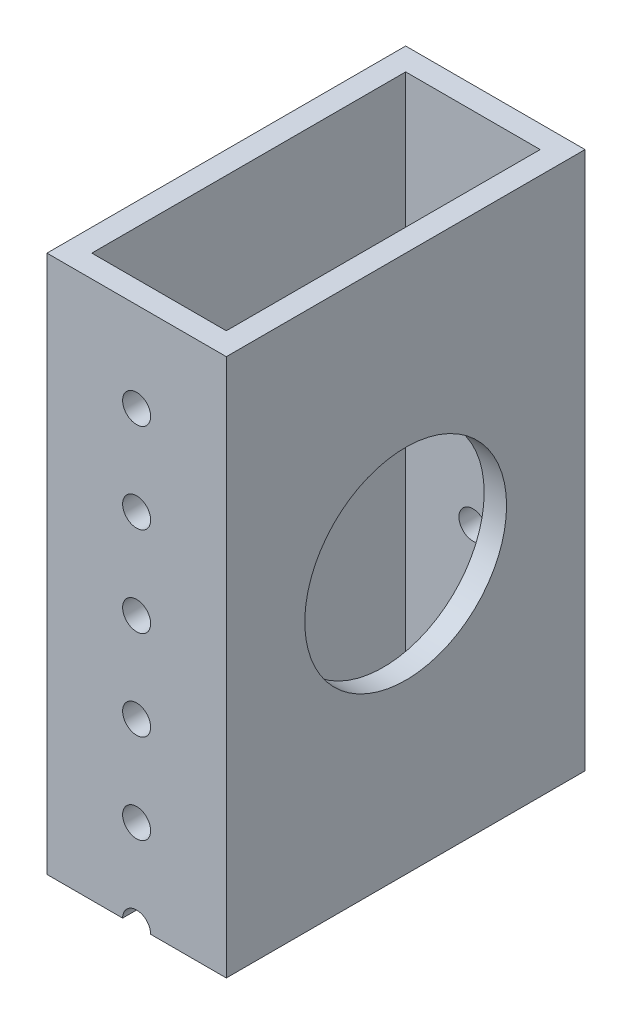
ISO-10303-21;
HEADER;
FILE_DESCRIPTION(('STEP AP214'),'2;1');
FILE_NAME('part.step','',(''),(''),'','','');
FILE_SCHEMA(('AUTOMOTIVE_DESIGN { 1 0 10303 214 1 1 1 1 }'));
ENDSEC;
DATA;
#1=APPLICATION_CONTEXT('core data for automotive mechanical design processes');
#2=APPLICATION_PROTOCOL_DEFINITION('international standard','automotive_design',2000,#1);
#3=PRODUCT_CONTEXT('',#1,'mechanical');
#4=PRODUCT('Part','Part','',(#3));
#5=PRODUCT_RELATED_PRODUCT_CATEGORY('part','',(#4));
#6=PRODUCT_DEFINITION_FORMATION('','',#4);
#7=PRODUCT_DEFINITION_CONTEXT('part definition',#1,'design');
#8=PRODUCT_DEFINITION('design','',#6,#7);
#9=PRODUCT_DEFINITION_SHAPE('','',#8);
#10=(LENGTH_UNIT() NAMED_UNIT(*) SI_UNIT(.MILLI.,.METRE.));
#11=(NAMED_UNIT(*) PLANE_ANGLE_UNIT() SI_UNIT($,.RADIAN.));
#12=(NAMED_UNIT(*) SI_UNIT($,.STERADIAN.) SOLID_ANGLE_UNIT());
#13=UNCERTAINTY_MEASURE_WITH_UNIT(LENGTH_MEASURE(1.E-05),#10,'distance_accuracy_value','');
#14=(GEOMETRIC_REPRESENTATION_CONTEXT(3) GLOBAL_UNCERTAINTY_ASSIGNED_CONTEXT((#13)) GLOBAL_UNIT_ASSIGNED_CONTEXT((#10,
#11,#12)) REPRESENTATION_CONTEXT('',''));
#15=CARTESIAN_POINT('',(0.,0.,0.));
#16=DIRECTION('',(0.,0.,1.));
#17=DIRECTION('',(1.,0.,0.));
#18=AXIS2_PLACEMENT_3D('',#15,#16,#17);
#19=CARTESIAN_POINT('',(0.,-38.1,0.));
#20=DIRECTION('',(0.,1.,0.));
#21=DIRECTION('',(0.,0.,1.));
#22=AXIS2_PLACEMENT_3D('',#19,#20,#21);
#23=PLANE('',#22);
#24=DIRECTION('',(1.,0.,0.));
#25=VECTOR('',#24,1.);
#26=CARTESIAN_POINT('',(-12.7,-38.1,25.4));
#27=LINE('',#26,#25);
#28=CARTESIAN_POINT('',(1.98437499999933,-38.1,25.4));
#29=VERTEX_POINT('',#28);
#30=CARTESIAN_POINT('',(12.7,-38.1,25.4));
#31=VERTEX_POINT('',#30);
#32=EDGE_CURVE('E165',#29,#31,#27,.T.);
#33=ORIENTED_EDGE('',*,*,#32,.F.);
#34=DIRECTION('',(0.,0.,-1.));
#35=VECTOR('',#34,1.);
#36=CARTESIAN_POINT('',(1.98437499999933,-38.1,-25.4));
#37=LINE('',#36,#35);
#38=CARTESIAN_POINT('',(1.98437499999933,-38.1,22.225));
#39=VERTEX_POINT('',#38);
#40=EDGE_CURVE('E68',#29,#39,#37,.T.);
#41=ORIENTED_EDGE('',*,*,#40,.T.);
#42=DIRECTION('',(1.,0.,0.));
#43=VECTOR('',#42,1.);
#44=CARTESIAN_POINT('',(-9.525,-38.1,22.225));
#45=LINE('',#44,#43);
#46=CARTESIAN_POINT('',(9.525,-38.1,22.225));
#47=VERTEX_POINT('',#46);
#48=EDGE_CURVE('E283',#39,#47,#45,.T.);
#49=ORIENTED_EDGE('',*,*,#48,.T.);
#50=DIRECTION('',(0.,0.,-1.));
#51=VECTOR('',#50,1.);
#52=CARTESIAN_POINT('',(9.525,-38.1,-22.225));
#53=LINE('',#52,#51);
#54=CARTESIAN_POINT('',(9.525,-38.1,-22.225));
#55=VERTEX_POINT('',#54);
#56=EDGE_CURVE('E267',#47,#55,#53,.T.);
#57=ORIENTED_EDGE('',*,*,#56,.T.);
#58=DIRECTION('',(-1.,0.,0.));
#59=VECTOR('',#58,1.);
#60=CARTESIAN_POINT('',(-9.525,-38.1,-22.225));
#61=LINE('',#60,#59);
#62=CARTESIAN_POINT('',(1.98437499999933,-38.1,-22.225));
#63=VERTEX_POINT('',#62);
#64=EDGE_CURVE('E275',#55,#63,#61,.T.);
#65=ORIENTED_EDGE('',*,*,#64,.T.);
#66=CARTESIAN_POINT('',(1.98437499999933,-38.1,-25.4));
#67=VERTEX_POINT('',#66);
#68=EDGE_CURVE('E60',#63,#67,#37,.T.);
#69=ORIENTED_EDGE('',*,*,#68,.T.);
#70=DIRECTION('',(-1.,0.,0.));
#71=VECTOR('',#70,1.);
#72=CARTESIAN_POINT('',(-12.7,-38.1,-25.4));
#73=LINE('',#72,#71);
#74=CARTESIAN_POINT('',(12.7,-38.1,-25.4));
#75=VERTEX_POINT('',#74);
#76=EDGE_CURVE('E308',#75,#67,#73,.T.);
#77=ORIENTED_EDGE('',*,*,#76,.F.);
#78=DIRECTION('',(0.,0.,-1.));
#79=VECTOR('',#78,1.);
#80=CARTESIAN_POINT('',(12.7,-38.1,-25.4));
#81=LINE('',#80,#79);
#82=EDGE_CURVE('E299',#31,#75,#81,.T.);
#83=ORIENTED_EDGE('',*,*,#82,.F.);
#84=EDGE_LOOP('',(#33,#41,#49,#57,#65,#69,#77,#83));
#85=FACE_BOUND('',#84,.T.);
#86=ADVANCED_FACE('F39',(#85),#23,.F.);
#87=CARTESIAN_POINT('',(0.,38.1,0.));
#88=DIRECTION('',(0.,1.,0.));
#89=DIRECTION('',(0.,0.,1.));
#90=AXIS2_PLACEMENT_3D('',#87,#88,#89);
#91=PLANE('',#90);
#92=DIRECTION('',(0.,0.,-1.));
#93=VECTOR('',#92,1.);
#94=CARTESIAN_POINT('',(12.7,38.1,-25.4));
#95=LINE('',#94,#93);
#96=CARTESIAN_POINT('',(12.7,38.1,25.4));
#97=VERTEX_POINT('',#96);
#98=CARTESIAN_POINT('',(12.7,38.1,-25.4));
#99=VERTEX_POINT('',#98);
#100=EDGE_CURVE('E164',#97,#99,#95,.T.);
#101=ORIENTED_EDGE('',*,*,#100,.T.);
#102=DIRECTION('',(-1.,0.,0.));
#103=VECTOR('',#102,1.);
#104=CARTESIAN_POINT('',(-12.7,38.1,-25.4));
#105=LINE('',#104,#103);
#106=CARTESIAN_POINT('',(-12.7,38.1,-25.4));
#107=VERTEX_POINT('',#106);
#108=EDGE_CURVE('E168',#99,#107,#105,.T.);
#109=ORIENTED_EDGE('',*,*,#108,.T.);
#110=DIRECTION('',(0.,0.,1.));
#111=VECTOR('',#110,1.);
#112=CARTESIAN_POINT('',(-12.7,38.1,-25.4));
#113=LINE('',#112,#111);
#114=CARTESIAN_POINT('',(-12.7,38.1,25.4));
#115=VERTEX_POINT('',#114);
#116=EDGE_CURVE('E302',#107,#115,#113,.T.);
#117=ORIENTED_EDGE('',*,*,#116,.T.);
#118=DIRECTION('',(1.,0.,0.));
#119=VECTOR('',#118,1.);
#120=CARTESIAN_POINT('',(-12.7,38.1,25.4));
#121=LINE('',#120,#119);
#122=EDGE_CURVE('E177',#115,#97,#121,.T.);
#123=ORIENTED_EDGE('',*,*,#122,.T.);
#124=EDGE_LOOP('',(#101,#109,#117,#123));
#125=FACE_BOUND('',#124,.T.);
#126=DIRECTION('',(0.,0.,1.));
#127=VECTOR('',#126,1.);
#128=CARTESIAN_POINT('',(-9.525,38.1,-22.225));
#129=LINE('',#128,#127);
#130=CARTESIAN_POINT('',(-9.525,38.1,-22.225));
#131=VERTEX_POINT('',#130);
#132=CARTESIAN_POINT('',(-9.525,38.1,22.225));
#133=VERTEX_POINT('',#132);
#134=EDGE_CURVE('E266',#131,#133,#129,.T.);
#135=ORIENTED_EDGE('',*,*,#134,.F.);
#136=DIRECTION('',(-1.,0.,0.));
#137=VECTOR('',#136,1.);
#138=CARTESIAN_POINT('',(-9.525,38.1,-22.225));
#139=LINE('',#138,#137);
#140=CARTESIAN_POINT('',(9.525,38.1,-22.225));
#141=VERTEX_POINT('',#140);
#142=EDGE_CURVE('E264',#141,#131,#139,.T.);
#143=ORIENTED_EDGE('',*,*,#142,.F.);
#144=DIRECTION('',(0.,0.,-1.));
#145=VECTOR('',#144,1.);
#146=CARTESIAN_POINT('',(9.525,38.1,-22.225));
#147=LINE('',#146,#145);
#148=CARTESIAN_POINT('',(9.525,38.1,22.225));
#149=VERTEX_POINT('',#148);
#150=EDGE_CURVE('E272',#149,#141,#147,.T.);
#151=ORIENTED_EDGE('',*,*,#150,.F.);
#152=DIRECTION('',(1.,0.,0.));
#153=VECTOR('',#152,1.);
#154=CARTESIAN_POINT('',(-9.525,38.1,22.225));
#155=LINE('',#154,#153);
#156=EDGE_CURVE('E269',#133,#149,#155,.T.);
#157=ORIENTED_EDGE('',*,*,#156,.F.);
#158=EDGE_LOOP('',(#135,#143,#151,#157));
#159=FACE_BOUND('',#158,.T.);
#160=ADVANCED_FACE('F324',(#125,#159),#91,.T.);
#161=CARTESIAN_POINT('',(-1.98437500000066,-38.1,-25.4));
#162=VERTEX_POINT('',#161);
#163=CARTESIAN_POINT('',(-12.7,-38.1,-25.4));
#164=VERTEX_POINT('',#163);
#165=EDGE_CURVE('E307',#162,#164,#73,.T.);
#166=ORIENTED_EDGE('',*,*,#165,.F.);
#167=DIRECTION('',(0.,0.,-1.));
#168=VECTOR('',#167,1.);
#169=CARTESIAN_POINT('',(-1.98437500000066,-38.1,-25.4));
#170=LINE('',#169,#168);
#171=CARTESIAN_POINT('',(-1.98437500000066,-38.1,-22.225));
#172=VERTEX_POINT('',#171);
#173=EDGE_CURVE('E158',#162,#172,#170,.F.);
#174=ORIENTED_EDGE('',*,*,#173,.T.);
#175=CARTESIAN_POINT('',(-9.525,-38.1,-22.225));
#176=VERTEX_POINT('',#175);
#177=EDGE_CURVE('E280',#172,#176,#61,.T.);
#178=ORIENTED_EDGE('',*,*,#177,.T.);
#179=DIRECTION('',(0.,0.,1.));
#180=VECTOR('',#179,1.);
#181=CARTESIAN_POINT('',(-9.525,-38.1,-22.225));
#182=LINE('',#181,#180);
#183=CARTESIAN_POINT('',(-9.525,-38.1,22.225));
#184=VERTEX_POINT('',#183);
#185=EDGE_CURVE('E279',#176,#184,#182,.T.);
#186=ORIENTED_EDGE('',*,*,#185,.T.);
#187=CARTESIAN_POINT('',(-1.98437500000066,-38.1,22.225));
#188=VERTEX_POINT('',#187);
#189=EDGE_CURVE('E156',#184,#188,#45,.T.);
#190=ORIENTED_EDGE('',*,*,#189,.T.);
#191=CARTESIAN_POINT('',(-1.98437500000065,-38.1,25.4));
#192=VERTEX_POINT('',#191);
#193=EDGE_CURVE('E139',#188,#192,#170,.F.);
#194=ORIENTED_EDGE('',*,*,#193,.T.);
#195=CARTESIAN_POINT('',(-12.7,-38.1,25.4));
#196=VERTEX_POINT('',#195);
#197=EDGE_CURVE('E153',#196,#192,#27,.T.);
#198=ORIENTED_EDGE('',*,*,#197,.F.);
#199=DIRECTION('',(0.,0.,1.));
#200=VECTOR('',#199,1.);
#201=CARTESIAN_POINT('',(-12.7,-38.1,-25.4));
#202=LINE('',#201,#200);
#203=EDGE_CURVE('E170',#164,#196,#202,.T.);
#204=ORIENTED_EDGE('',*,*,#203,.F.);
#205=EDGE_LOOP('',(#166,#174,#178,#186,#190,#194,#198,#204));
#206=FACE_BOUND('',#205,.T.);
#207=ADVANCED_FACE('F151',(#206),#23,.F.);
#208=CARTESIAN_POINT('',(12.7,38.1,-25.4));
#209=DIRECTION('',(-1.,0.,0.));
#210=DIRECTION('',(0.,0.,1.));
#211=AXIS2_PLACEMENT_3D('',#208,#209,#210);
#212=PLANE('',#211);
#213=CARTESIAN_POINT('',(12.7,0.,0.));
#214=DIRECTION('',(1.,0.,0.));
#215=DIRECTION('',(0.,0.,-1.));
#216=AXIS2_PLACEMENT_3D('',#213,#214,#215);
#217=CIRCLE('',#216,14.2875);
#218=CARTESIAN_POINT('',(12.7,0.,-14.2875));
#219=VERTEX_POINT('',#218);
#220=EDGE_CURVE('E382',#219,#219,#217,.T.);
#221=ORIENTED_EDGE('',*,*,#220,.F.);
#222=EDGE_LOOP('',(#221));
#223=FACE_BOUND('',#222,.T.);
#224=ORIENTED_EDGE('',*,*,#82,.T.);
#225=DIRECTION('',(0.,-1.,0.));
#226=VECTOR('',#225,1.);
#227=CARTESIAN_POINT('',(12.7,38.1,-25.4));
#228=LINE('',#227,#226);
#229=EDGE_CURVE('E11',#99,#75,#228,.T.);
#230=ORIENTED_EDGE('',*,*,#229,.F.);
#231=ORIENTED_EDGE('',*,*,#100,.F.);
#232=DIRECTION('',(0.,-1.,0.));
#233=VECTOR('',#232,1.);
#234=CARTESIAN_POINT('',(12.7,38.1,25.4));
#235=LINE('',#234,#233);
#236=EDGE_CURVE('E174',#97,#31,#235,.T.);
#237=ORIENTED_EDGE('',*,*,#236,.T.);
#238=EDGE_LOOP('',(#224,#230,#231,#237));
#239=FACE_BOUND('',#238,.T.);
#240=ADVANCED_FACE('F41',(#223,#239),#212,.F.);
#241=CARTESIAN_POINT('',(-12.7,38.1,-25.4));
#242=DIRECTION('',(0.,0.,1.));
#243=DIRECTION('',(1.,0.,0.));
#244=AXIS2_PLACEMENT_3D('',#241,#242,#243);
#245=PLANE('',#244);
#246=CARTESIAN_POINT('',(0.,25.4,-25.4));
#247=DIRECTION('',(0.,0.,-1.));
#248=DIRECTION('',(-1.,0.,0.));
#249=AXIS2_PLACEMENT_3D('',#246,#247,#248);
#250=CIRCLE('',#249,1.98437499999999);
#251=CARTESIAN_POINT('',(-1.98437499999999,25.4,-25.4));
#252=VERTEX_POINT('',#251);
#253=EDGE_CURVE('E212',#252,#252,#250,.T.);
#254=ORIENTED_EDGE('',*,*,#253,.F.);
#255=EDGE_LOOP('',(#254));
#256=FACE_BOUND('',#255,.T.);
#257=CARTESIAN_POINT('',(-1.33025439009923E-13,12.7,-25.4));
#258=DIRECTION('',(0.,0.,-1.));
#259=DIRECTION('',(-1.,0.,0.));
#260=AXIS2_PLACEMENT_3D('',#257,#258,#259);
#261=CIRCLE('',#260,1.98437499999999);
#262=CARTESIAN_POINT('',(-1.98437500000013,12.7,-25.4));
#263=VERTEX_POINT('',#262);
#264=EDGE_CURVE('E209',#263,#263,#261,.T.);
#265=ORIENTED_EDGE('',*,*,#264,.F.);
#266=EDGE_LOOP('',(#265));
#267=FACE_BOUND('',#266,.T.);
#268=CARTESIAN_POINT('',(-2.66050878019846E-13,0.,-25.4));
#269=DIRECTION('',(0.,0.,-1.));
#270=DIRECTION('',(-1.,0.,0.));
#271=AXIS2_PLACEMENT_3D('',#268,#269,#270);
#272=CIRCLE('',#271,1.98437499999999);
#273=CARTESIAN_POINT('',(-1.98437500000026,0.,-25.4));
#274=VERTEX_POINT('',#273);
#275=EDGE_CURVE('E230',#274,#274,#272,.T.);
#276=ORIENTED_EDGE('',*,*,#275,.F.);
#277=EDGE_LOOP('',(#276));
#278=FACE_BOUND('',#277,.T.);
#279=CARTESIAN_POINT('',(-3.9907631702977E-13,-12.7,-25.4));
#280=DIRECTION('',(0.,0.,-1.));
#281=DIRECTION('',(-1.,0.,0.));
#282=AXIS2_PLACEMENT_3D('',#279,#280,#281);
#283=CIRCLE('',#282,1.98437499999999);
#284=CARTESIAN_POINT('',(-1.98437500000039,-12.7,-25.4));
#285=VERTEX_POINT('',#284);
#286=EDGE_CURVE('E239',#285,#285,#283,.T.);
#287=ORIENTED_EDGE('',*,*,#286,.F.);
#288=EDGE_LOOP('',(#287));
#289=FACE_BOUND('',#288,.T.);
#290=CARTESIAN_POINT('',(-5.32101756039693E-13,-25.3999999999999,-25.4));
#291=DIRECTION('',(0.,0.,-1.));
#292=DIRECTION('',(-1.,0.,0.));
#293=AXIS2_PLACEMENT_3D('',#290,#291,#292);
#294=CIRCLE('',#293,1.98437499999999);
#295=CARTESIAN_POINT('',(-1.98437500000053,-25.3999999999999,-25.4));
#296=VERTEX_POINT('',#295);
#297=EDGE_CURVE('E248',#296,#296,#294,.T.);
#298=ORIENTED_EDGE('',*,*,#297,.F.);
#299=EDGE_LOOP('',(#298));
#300=FACE_BOUND('',#299,.T.);
#301=ORIENTED_EDGE('',*,*,#76,.T.);
#302=CARTESIAN_POINT('',(-6.65127195049616E-13,-38.0999999999999,-25.4));
#303=DIRECTION('',(0.,0.,-1.));
#304=DIRECTION('',(-1.,0.,0.));
#305=AXIS2_PLACEMENT_3D('',#302,#303,#304);
#306=CIRCLE('',#305,1.98437499999999);
#307=EDGE_CURVE('E145',#162,#67,#306,.T.);
#308=ORIENTED_EDGE('',*,*,#307,.F.);
#309=ORIENTED_EDGE('',*,*,#165,.T.);
#310=DIRECTION('',(0.,-1.,0.));
#311=VECTOR('',#310,1.);
#312=CARTESIAN_POINT('',(-12.7,38.1,-25.4));
#313=LINE('',#312,#311);
#314=EDGE_CURVE('E49',#107,#164,#313,.T.);
#315=ORIENTED_EDGE('',*,*,#314,.F.);
#316=ORIENTED_EDGE('',*,*,#108,.F.);
#317=ORIENTED_EDGE('',*,*,#229,.T.);
#318=EDGE_LOOP('',(#301,#308,#309,#315,#316,#317));
#319=FACE_BOUND('',#318,.T.);
#320=ADVANCED_FACE('F318',(#256,#267,#278,#289,#300,#319),#245,.F.);
#321=CARTESIAN_POINT('',(-12.7,38.1,-25.4));
#322=DIRECTION('',(1.,0.,0.));
#323=DIRECTION('',(0.,0.,-1.));
#324=AXIS2_PLACEMENT_3D('',#321,#322,#323);
#325=PLANE('',#324);
#326=CARTESIAN_POINT('',(-12.7,0.,0.));
#327=DIRECTION('',(1.,0.,0.));
#328=DIRECTION('',(0.,0.,-1.));
#329=AXIS2_PLACEMENT_3D('',#326,#327,#328);
#330=CIRCLE('',#329,14.2875);
#331=CARTESIAN_POINT('',(-12.7,0.,-14.2875));
#332=VERTEX_POINT('',#331);
#333=EDGE_CURVE('E384',#332,#332,#330,.T.);
#334=ORIENTED_EDGE('',*,*,#333,.T.);
#335=EDGE_LOOP('',(#334));
#336=FACE_BOUND('',#335,.T.);
#337=ORIENTED_EDGE('',*,*,#203,.T.);
#338=DIRECTION('',(0.,-1.,0.));
#339=VECTOR('',#338,1.);
#340=CARTESIAN_POINT('',(-12.7,38.1,25.4));
#341=LINE('',#340,#339);
#342=EDGE_CURVE('E163',#115,#196,#341,.T.);
#343=ORIENTED_EDGE('',*,*,#342,.F.);
#344=ORIENTED_EDGE('',*,*,#116,.F.);
#345=ORIENTED_EDGE('',*,*,#314,.T.);
#346=EDGE_LOOP('',(#337,#343,#344,#345));
#347=FACE_BOUND('',#346,.T.);
#348=ADVANCED_FACE('F322',(#336,#347),#325,.F.);
#349=CARTESIAN_POINT('',(-12.7,38.1,25.4));
#350=DIRECTION('',(0.,0.,-1.));
#351=DIRECTION('',(-1.,0.,0.));
#352=AXIS2_PLACEMENT_3D('',#349,#350,#351);
#353=PLANE('',#352);
#354=CARTESIAN_POINT('',(0.,25.4,25.4));
#355=DIRECTION('',(0.,0.,-1.));
#356=DIRECTION('',(-1.,0.,0.));
#357=AXIS2_PLACEMENT_3D('',#354,#355,#356);
#358=CIRCLE('',#357,1.98437499999999);
#359=CARTESIAN_POINT('',(-1.98437499999999,25.4,25.4));
#360=VERTEX_POINT('',#359);
#361=EDGE_CURVE('E204',#360,#360,#358,.T.);
#362=ORIENTED_EDGE('',*,*,#361,.T.);
#363=EDGE_LOOP('',(#362));
#364=FACE_BOUND('',#363,.T.);
#365=CARTESIAN_POINT('',(-1.33025439009923E-13,12.7,25.4));
#366=DIRECTION('',(0.,0.,-1.));
#367=DIRECTION('',(-1.,0.,0.));
#368=AXIS2_PLACEMENT_3D('',#365,#366,#367);
#369=CIRCLE('',#368,1.98437499999999);
#370=CARTESIAN_POINT('',(-1.98437500000012,12.7,25.4));
#371=VERTEX_POINT('',#370);
#372=EDGE_CURVE('E200',#371,#371,#369,.T.);
#373=ORIENTED_EDGE('',*,*,#372,.T.);
#374=EDGE_LOOP('',(#373));
#375=FACE_BOUND('',#374,.T.);
#376=CARTESIAN_POINT('',(-2.66050878019846E-13,0.,25.4));
#377=DIRECTION('',(0.,0.,-1.));
#378=DIRECTION('',(-1.,0.,0.));
#379=AXIS2_PLACEMENT_3D('',#376,#377,#378);
#380=CIRCLE('',#379,1.98437499999999);
#381=CARTESIAN_POINT('',(-1.98437500000025,0.,25.4));
#382=VERTEX_POINT('',#381);
#383=EDGE_CURVE('E196',#382,#382,#380,.T.);
#384=ORIENTED_EDGE('',*,*,#383,.T.);
#385=EDGE_LOOP('',(#384));
#386=FACE_BOUND('',#385,.T.);
#387=CARTESIAN_POINT('',(-3.9907631702977E-13,-12.7,25.4));
#388=DIRECTION('',(0.,0.,-1.));
#389=DIRECTION('',(-1.,0.,0.));
#390=AXIS2_PLACEMENT_3D('',#387,#388,#389);
#391=CIRCLE('',#390,1.98437499999999);
#392=CARTESIAN_POINT('',(-1.98437500000039,-12.7,25.4));
#393=VERTEX_POINT('',#392);
#394=EDGE_CURVE('E191',#393,#393,#391,.T.);
#395=ORIENTED_EDGE('',*,*,#394,.T.);
#396=EDGE_LOOP('',(#395));
#397=FACE_BOUND('',#396,.T.);
#398=CARTESIAN_POINT('',(-5.32101756039693E-13,-25.3999999999999,25.4));
#399=DIRECTION('',(0.,0.,-1.));
#400=DIRECTION('',(-1.,0.,0.));
#401=AXIS2_PLACEMENT_3D('',#398,#399,#400);
#402=CIRCLE('',#401,1.98437499999999);
#403=CARTESIAN_POINT('',(-1.98437500000052,-25.3999999999999,25.4));
#404=VERTEX_POINT('',#403);
#405=EDGE_CURVE('E186',#404,#404,#402,.T.);
#406=ORIENTED_EDGE('',*,*,#405,.T.);
#407=EDGE_LOOP('',(#406));
#408=FACE_BOUND('',#407,.T.);
#409=ORIENTED_EDGE('',*,*,#197,.T.);
#410=CARTESIAN_POINT('',(-6.65127195049616E-13,-38.0999999999999,25.4));
#411=DIRECTION('',(0.,0.,-1.));
#412=DIRECTION('',(-1.,0.,0.));
#413=AXIS2_PLACEMENT_3D('',#410,#411,#412);
#414=CIRCLE('',#413,1.98437499999999);
#415=EDGE_CURVE('E136',#192,#29,#414,.T.);
#416=ORIENTED_EDGE('',*,*,#415,.T.);
#417=ORIENTED_EDGE('',*,*,#32,.T.);
#418=ORIENTED_EDGE('',*,*,#236,.F.);
#419=ORIENTED_EDGE('',*,*,#122,.F.);
#420=ORIENTED_EDGE('',*,*,#342,.T.);
#421=EDGE_LOOP('',(#409,#416,#417,#418,#419,#420));
#422=FACE_BOUND('',#421,.T.);
#423=ADVANCED_FACE('F160',(#364,#375,#386,#397,#408,#422),#353,.F.);
#424=CARTESIAN_POINT('',(-9.525,38.1,-22.225));
#425=DIRECTION('',(0.,0.,1.));
#426=DIRECTION('',(1.,0.,0.));
#427=AXIS2_PLACEMENT_3D('',#424,#425,#426);
#428=PLANE('',#427);
#429=CARTESIAN_POINT('',(0.,25.4,-22.225));
#430=DIRECTION('',(0.,0.,1.));
#431=DIRECTION('',(1.,0.,0.));
#432=AXIS2_PLACEMENT_3D('',#429,#430,#431);
#433=CIRCLE('',#432,1.98437499999999);
#434=CARTESIAN_POINT('',(1.98437499999999,25.4,-22.225));
#435=VERTEX_POINT('',#434);
#436=EDGE_CURVE('E203',#435,#435,#433,.T.);
#437=ORIENTED_EDGE('',*,*,#436,.F.);
#438=EDGE_LOOP('',(#437));
#439=FACE_BOUND('',#438,.T.);
#440=CARTESIAN_POINT('',(-1.33025439009923E-13,12.7,-22.225));
#441=DIRECTION('',(0.,0.,1.));
#442=DIRECTION('',(1.,0.,0.));
#443=AXIS2_PLACEMENT_3D('',#440,#441,#442);
#444=CIRCLE('',#443,1.98437499999999);
#445=CARTESIAN_POINT('',(1.98437499999986,12.7,-22.225));
#446=VERTEX_POINT('',#445);
#447=EDGE_CURVE('E199',#446,#446,#444,.T.);
#448=ORIENTED_EDGE('',*,*,#447,.F.);
#449=EDGE_LOOP('',(#448));
#450=FACE_BOUND('',#449,.T.);
#451=CARTESIAN_POINT('',(-2.66050878019846E-13,0.,-22.225));
#452=DIRECTION('',(0.,0.,1.));
#453=DIRECTION('',(1.,0.,0.));
#454=AXIS2_PLACEMENT_3D('',#451,#452,#453);
#455=CIRCLE('',#454,1.98437499999999);
#456=CARTESIAN_POINT('',(1.98437499999973,0.,-22.225));
#457=VERTEX_POINT('',#456);
#458=EDGE_CURVE('E195',#457,#457,#455,.T.);
#459=ORIENTED_EDGE('',*,*,#458,.F.);
#460=EDGE_LOOP('',(#459));
#461=FACE_BOUND('',#460,.T.);
#462=CARTESIAN_POINT('',(-3.9907631702977E-13,-12.7,-22.225));
#463=DIRECTION('',(0.,0.,1.));
#464=DIRECTION('',(1.,0.,0.));
#465=AXIS2_PLACEMENT_3D('',#462,#463,#464);
#466=CIRCLE('',#465,1.98437499999999);
#467=CARTESIAN_POINT('',(1.98437499999959,-12.7,-22.225));
#468=VERTEX_POINT('',#467);
#469=EDGE_CURVE('E190',#468,#468,#466,.T.);
#470=ORIENTED_EDGE('',*,*,#469,.F.);
#471=EDGE_LOOP('',(#470));
#472=FACE_BOUND('',#471,.T.);
#473=CARTESIAN_POINT('',(-5.32101756039693E-13,-25.3999999999999,-22.225));
#474=DIRECTION('',(0.,0.,1.));
#475=DIRECTION('',(1.,0.,0.));
#476=AXIS2_PLACEMENT_3D('',#473,#474,#475);
#477=CIRCLE('',#476,1.98437499999999);
#478=CARTESIAN_POINT('',(1.98437499999946,-25.3999999999999,-22.225));
#479=VERTEX_POINT('',#478);
#480=EDGE_CURVE('E185',#479,#479,#477,.T.);
#481=ORIENTED_EDGE('',*,*,#480,.F.);
#482=EDGE_LOOP('',(#481));
#483=FACE_BOUND('',#482,.T.);
#484=CARTESIAN_POINT('',(-6.65127195049616E-13,-38.0999999999999,-22.225));
#485=DIRECTION('',(0.,0.,1.));
#486=DIRECTION('',(1.,0.,0.));
#487=AXIS2_PLACEMENT_3D('',#484,#485,#486);
#488=CIRCLE('',#487,1.98437499999999);
#489=EDGE_CURVE('E261',#63,#172,#488,.T.);
#490=ORIENTED_EDGE('',*,*,#489,.F.);
#491=ORIENTED_EDGE('',*,*,#64,.F.);
#492=DIRECTION('',(0.,-1.,0.));
#493=VECTOR('',#492,1.);
#494=CARTESIAN_POINT('',(9.525,38.1,-22.225));
#495=LINE('',#494,#493);
#496=EDGE_CURVE('E274',#141,#55,#495,.T.);
#497=ORIENTED_EDGE('',*,*,#496,.F.);
#498=ORIENTED_EDGE('',*,*,#142,.T.);
#499=DIRECTION('',(0.,-1.,0.));
#500=VECTOR('',#499,1.);
#501=CARTESIAN_POINT('',(-9.525,38.1,-22.225));
#502=LINE('',#501,#500);
#503=EDGE_CURVE('E296',#131,#176,#502,.T.);
#504=ORIENTED_EDGE('',*,*,#503,.T.);
#505=ORIENTED_EDGE('',*,*,#177,.F.);
#506=EDGE_LOOP('',(#490,#491,#497,#498,#504,#505));
#507=FACE_BOUND('',#506,.T.);
#508=ADVANCED_FACE('F336',(#439,#450,#461,#472,#483,#507),#428,.T.);
#509=CARTESIAN_POINT('',(-9.525,38.1,-22.225));
#510=DIRECTION('',(1.,0.,0.));
#511=DIRECTION('',(0.,0.,-1.));
#512=AXIS2_PLACEMENT_3D('',#509,#510,#511);
#513=PLANE('',#512);
#514=CARTESIAN_POINT('',(-9.525,0.,0.));
#515=DIRECTION('',(1.,0.,0.));
#516=DIRECTION('',(0.,0.,-1.));
#517=AXIS2_PLACEMENT_3D('',#514,#515,#516);
#518=CIRCLE('',#517,14.2875);
#519=CARTESIAN_POINT('',(-9.525,0.,-14.2875));
#520=VERTEX_POINT('',#519);
#521=EDGE_CURVE('E218',#520,#520,#518,.T.);
#522=ORIENTED_EDGE('',*,*,#521,.F.);
#523=EDGE_LOOP('',(#522));
#524=FACE_BOUND('',#523,.T.);
#525=ORIENTED_EDGE('',*,*,#185,.F.);
#526=ORIENTED_EDGE('',*,*,#503,.F.);
#527=ORIENTED_EDGE('',*,*,#134,.T.);
#528=DIRECTION('',(0.,-1.,0.));
#529=VECTOR('',#528,1.);
#530=CARTESIAN_POINT('',(-9.525,38.1,22.225));
#531=LINE('',#530,#529);
#532=EDGE_CURVE('E294',#133,#184,#531,.T.);
#533=ORIENTED_EDGE('',*,*,#532,.T.);
#534=EDGE_LOOP('',(#525,#526,#527,#533));
#535=FACE_BOUND('',#534,.T.);
#536=ADVANCED_FACE('F342',(#524,#535),#513,.T.);
#537=CARTESIAN_POINT('',(-9.525,38.1,22.225));
#538=DIRECTION('',(0.,0.,-1.));
#539=DIRECTION('',(-1.,0.,0.));
#540=AXIS2_PLACEMENT_3D('',#537,#538,#539);
#541=PLANE('',#540);
#542=CARTESIAN_POINT('',(0.,25.4,22.225));
#543=DIRECTION('',(0.,0.,-1.));
#544=DIRECTION('',(-1.,0.,0.));
#545=AXIS2_PLACEMENT_3D('',#542,#543,#544);
#546=CIRCLE('',#545,1.98437499999999);
#547=CARTESIAN_POINT('',(-1.98437499999999,25.4,22.225));
#548=VERTEX_POINT('',#547);
#549=EDGE_CURVE('E201',#548,#548,#546,.T.);
#550=ORIENTED_EDGE('',*,*,#549,.F.);
#551=EDGE_LOOP('',(#550));
#552=FACE_BOUND('',#551,.T.);
#553=CARTESIAN_POINT('',(-1.33025439009923E-13,12.7,22.225));
#554=DIRECTION('',(0.,0.,-1.));
#555=DIRECTION('',(-1.,0.,0.));
#556=AXIS2_PLACEMENT_3D('',#553,#554,#555);
#557=CIRCLE('',#556,1.98437499999999);
#558=CARTESIAN_POINT('',(-1.98437500000012,12.7,22.225));
#559=VERTEX_POINT('',#558);
#560=EDGE_CURVE('E197',#559,#559,#557,.T.);
#561=ORIENTED_EDGE('',*,*,#560,.F.);
#562=EDGE_LOOP('',(#561));
#563=FACE_BOUND('',#562,.T.);
#564=CARTESIAN_POINT('',(-2.66050878019846E-13,0.,22.225));
#565=DIRECTION('',(0.,0.,-1.));
#566=DIRECTION('',(-1.,0.,0.));
#567=AXIS2_PLACEMENT_3D('',#564,#565,#566);
#568=CIRCLE('',#567,1.98437499999999);
#569=CARTESIAN_POINT('',(-1.98437500000026,0.,22.225));
#570=VERTEX_POINT('',#569);
#571=EDGE_CURVE('E192',#570,#570,#568,.T.);
#572=ORIENTED_EDGE('',*,*,#571,.F.);
#573=EDGE_LOOP('',(#572));
#574=FACE_BOUND('',#573,.T.);
#575=CARTESIAN_POINT('',(-3.9907631702977E-13,-12.7,22.225));
#576=DIRECTION('',(0.,0.,-1.));
#577=DIRECTION('',(-1.,0.,0.));
#578=AXIS2_PLACEMENT_3D('',#575,#576,#577);
#579=CIRCLE('',#578,1.98437499999999);
#580=CARTESIAN_POINT('',(-1.98437500000039,-12.7,22.225));
#581=VERTEX_POINT('',#580);
#582=EDGE_CURVE('E187',#581,#581,#579,.T.);
#583=ORIENTED_EDGE('',*,*,#582,.F.);
#584=EDGE_LOOP('',(#583));
#585=FACE_BOUND('',#584,.T.);
#586=CARTESIAN_POINT('',(-5.32101756039693E-13,-25.3999999999999,22.225));
#587=DIRECTION('',(0.,0.,-1.));
#588=DIRECTION('',(-1.,0.,0.));
#589=AXIS2_PLACEMENT_3D('',#586,#587,#588);
#590=CIRCLE('',#589,1.98437499999999);
#591=CARTESIAN_POINT('',(-1.98437500000052,-25.3999999999999,22.225));
#592=VERTEX_POINT('',#591);
#593=EDGE_CURVE('E182',#592,#592,#590,.T.);
#594=ORIENTED_EDGE('',*,*,#593,.F.);
#595=EDGE_LOOP('',(#594));
#596=FACE_BOUND('',#595,.T.);
#597=CARTESIAN_POINT('',(-6.65127195049616E-13,-38.0999999999999,22.225));
#598=DIRECTION('',(0.,0.,-1.));
#599=DIRECTION('',(-1.,0.,0.));
#600=AXIS2_PLACEMENT_3D('',#597,#598,#599);
#601=CIRCLE('',#600,1.98437499999999);
#602=EDGE_CURVE('E144',#188,#39,#601,.T.);
#603=ORIENTED_EDGE('',*,*,#602,.F.);
#604=ORIENTED_EDGE('',*,*,#189,.F.);
#605=ORIENTED_EDGE('',*,*,#532,.F.);
#606=ORIENTED_EDGE('',*,*,#156,.T.);
#607=DIRECTION('',(0.,-1.,0.));
#608=VECTOR('',#607,1.);
#609=CARTESIAN_POINT('',(9.525,38.1,22.225));
#610=LINE('',#609,#608);
#611=EDGE_CURVE('E291',#149,#47,#610,.T.);
#612=ORIENTED_EDGE('',*,*,#611,.T.);
#613=ORIENTED_EDGE('',*,*,#48,.F.);
#614=EDGE_LOOP('',(#603,#604,#605,#606,#612,#613));
#615=FACE_BOUND('',#614,.T.);
#616=ADVANCED_FACE('F347',(#552,#563,#574,#585,#596,#615),#541,.T.);
#617=CARTESIAN_POINT('',(9.525,38.1,-22.225));
#618=DIRECTION('',(-1.,0.,0.));
#619=DIRECTION('',(0.,0.,1.));
#620=AXIS2_PLACEMENT_3D('',#617,#618,#619);
#621=PLANE('',#620);
#622=CARTESIAN_POINT('',(9.525,0.,0.));
#623=DIRECTION('',(-1.,0.,0.));
#624=DIRECTION('',(0.,0.,1.));
#625=AXIS2_PLACEMENT_3D('',#622,#623,#624);
#626=CIRCLE('',#625,14.2875);
#627=CARTESIAN_POINT('',(9.525,0.,14.2875));
#628=VERTEX_POINT('',#627);
#629=EDGE_CURVE('E43',#628,#628,#626,.T.);
#630=ORIENTED_EDGE('',*,*,#629,.F.);
#631=EDGE_LOOP('',(#630));
#632=FACE_BOUND('',#631,.T.);
#633=ORIENTED_EDGE('',*,*,#56,.F.);
#634=ORIENTED_EDGE('',*,*,#611,.F.);
#635=ORIENTED_EDGE('',*,*,#150,.T.);
#636=ORIENTED_EDGE('',*,*,#496,.T.);
#637=EDGE_LOOP('',(#633,#634,#635,#636));
#638=FACE_BOUND('',#637,.T.);
#639=ADVANCED_FACE('F351',(#632,#638),#621,.T.);
#640=CARTESIAN_POINT('',(-6.65127195049616E-13,-38.0999999999999,-25.4));
#641=DIRECTION('',(0.,0.,-1.));
#642=DIRECTION('',(-1.,0.,0.));
#643=AXIS2_PLACEMENT_3D('',#640,#641,#642);
#644=CYLINDRICAL_SURFACE('',#643,1.98437499999999);
#645=ORIENTED_EDGE('',*,*,#415,.F.);
#646=ORIENTED_EDGE('',*,*,#193,.F.);
#647=ORIENTED_EDGE('',*,*,#602,.T.);
#648=ORIENTED_EDGE('',*,*,#40,.F.);
#649=EDGE_LOOP('',(#645,#646,#647,#648));
#650=FACE_BOUND('',#649,.T.);
#651=ADVANCED_FACE('F138',(#650),#644,.F.);
#652=ORIENTED_EDGE('',*,*,#489,.T.);
#653=ORIENTED_EDGE('',*,*,#173,.F.);
#654=ORIENTED_EDGE('',*,*,#307,.T.);
#655=ORIENTED_EDGE('',*,*,#68,.F.);
#656=EDGE_LOOP('',(#652,#653,#654,#655));
#657=FACE_BOUND('',#656,.T.);
#658=ADVANCED_FACE('F359',(#657),#644,.F.);
#659=CARTESIAN_POINT('',(-5.32101756039693E-13,-25.3999999999999,-25.4));
#660=DIRECTION('',(0.,0.,-1.));
#661=DIRECTION('',(-1.,0.,0.));
#662=AXIS2_PLACEMENT_3D('',#659,#660,#661);
#663=CYLINDRICAL_SURFACE('',#662,1.98437499999999);
#664=ORIENTED_EDGE('',*,*,#593,.T.);
#665=EDGE_LOOP('',(#664));
#666=FACE_BOUND('',#665,.T.);
#667=ORIENTED_EDGE('',*,*,#405,.F.);
#668=EDGE_LOOP('',(#667));
#669=FACE_BOUND('',#668,.T.);
#670=ADVANCED_FACE('F425',(#666,#669),#663,.F.);
#671=ORIENTED_EDGE('',*,*,#480,.T.);
#672=EDGE_LOOP('',(#671));
#673=FACE_BOUND('',#672,.T.);
#674=ORIENTED_EDGE('',*,*,#297,.T.);
#675=EDGE_LOOP('',(#674));
#676=FACE_BOUND('',#675,.T.);
#677=ADVANCED_FACE('F423',(#673,#676),#663,.F.);
#678=CARTESIAN_POINT('',(-3.9907631702977E-13,-12.7,-25.4));
#679=DIRECTION('',(0.,0.,-1.));
#680=DIRECTION('',(-1.,0.,0.));
#681=AXIS2_PLACEMENT_3D('',#678,#679,#680);
#682=CYLINDRICAL_SURFACE('',#681,1.98437499999999);
#683=ORIENTED_EDGE('',*,*,#582,.T.);
#684=EDGE_LOOP('',(#683));
#685=FACE_BOUND('',#684,.T.);
#686=ORIENTED_EDGE('',*,*,#394,.F.);
#687=EDGE_LOOP('',(#686));
#688=FACE_BOUND('',#687,.T.);
#689=ADVANCED_FACE('F420',(#685,#688),#682,.F.);
#690=ORIENTED_EDGE('',*,*,#469,.T.);
#691=EDGE_LOOP('',(#690));
#692=FACE_BOUND('',#691,.T.);
#693=ORIENTED_EDGE('',*,*,#286,.T.);
#694=EDGE_LOOP('',(#693));
#695=FACE_BOUND('',#694,.T.);
#696=ADVANCED_FACE('F418',(#692,#695),#682,.F.);
#697=CARTESIAN_POINT('',(-2.66050878019846E-13,0.,-25.4));
#698=DIRECTION('',(0.,0.,-1.));
#699=DIRECTION('',(-1.,0.,0.));
#700=AXIS2_PLACEMENT_3D('',#697,#698,#699);
#701=CYLINDRICAL_SURFACE('',#700,1.98437499999999);
#702=ORIENTED_EDGE('',*,*,#571,.T.);
#703=EDGE_LOOP('',(#702));
#704=FACE_BOUND('',#703,.T.);
#705=ORIENTED_EDGE('',*,*,#383,.F.);
#706=EDGE_LOOP('',(#705));
#707=FACE_BOUND('',#706,.T.);
#708=ADVANCED_FACE('F415',(#704,#707),#701,.F.);
#709=ORIENTED_EDGE('',*,*,#458,.T.);
#710=EDGE_LOOP('',(#709));
#711=FACE_BOUND('',#710,.T.);
#712=ORIENTED_EDGE('',*,*,#275,.T.);
#713=EDGE_LOOP('',(#712));
#714=FACE_BOUND('',#713,.T.);
#715=ADVANCED_FACE('F413',(#711,#714),#701,.F.);
#716=CARTESIAN_POINT('',(-1.33025439009923E-13,12.7,-25.4));
#717=DIRECTION('',(0.,0.,-1.));
#718=DIRECTION('',(-1.,0.,0.));
#719=AXIS2_PLACEMENT_3D('',#716,#717,#718);
#720=CYLINDRICAL_SURFACE('',#719,1.98437499999999);
#721=ORIENTED_EDGE('',*,*,#560,.T.);
#722=EDGE_LOOP('',(#721));
#723=FACE_BOUND('',#722,.T.);
#724=ORIENTED_EDGE('',*,*,#372,.F.);
#725=EDGE_LOOP('',(#724));
#726=FACE_BOUND('',#725,.T.);
#727=ADVANCED_FACE('F410',(#723,#726),#720,.F.);
#728=ORIENTED_EDGE('',*,*,#447,.T.);
#729=EDGE_LOOP('',(#728));
#730=FACE_BOUND('',#729,.T.);
#731=ORIENTED_EDGE('',*,*,#264,.T.);
#732=EDGE_LOOP('',(#731));
#733=FACE_BOUND('',#732,.T.);
#734=ADVANCED_FACE('F409',(#730,#733),#720,.F.);
#735=CARTESIAN_POINT('',(0.,25.4,-25.4));
#736=DIRECTION('',(0.,0.,-1.));
#737=DIRECTION('',(-1.,0.,0.));
#738=AXIS2_PLACEMENT_3D('',#735,#736,#737);
#739=CYLINDRICAL_SURFACE('',#738,1.98437499999999);
#740=ORIENTED_EDGE('',*,*,#549,.T.);
#741=EDGE_LOOP('',(#740));
#742=FACE_BOUND('',#741,.T.);
#743=ORIENTED_EDGE('',*,*,#361,.F.);
#744=EDGE_LOOP('',(#743));
#745=FACE_BOUND('',#744,.T.);
#746=ADVANCED_FACE('F404',(#742,#745),#739,.F.);
#747=ORIENTED_EDGE('',*,*,#436,.T.);
#748=EDGE_LOOP('',(#747));
#749=FACE_BOUND('',#748,.T.);
#750=ORIENTED_EDGE('',*,*,#253,.T.);
#751=EDGE_LOOP('',(#750));
#752=FACE_BOUND('',#751,.T.);
#753=ADVANCED_FACE('F398',(#749,#752),#739,.F.);
#754=CARTESIAN_POINT('',(-12.7,0.,0.));
#755=DIRECTION('',(1.,0.,0.));
#756=DIRECTION('',(0.,0.,-1.));
#757=AXIS2_PLACEMENT_3D('',#754,#755,#756);
#758=CYLINDRICAL_SURFACE('',#757,14.2875);
#759=ORIENTED_EDGE('',*,*,#629,.T.);
#760=EDGE_LOOP('',(#759));
#761=FACE_BOUND('',#760,.T.);
#762=ORIENTED_EDGE('',*,*,#220,.T.);
#763=EDGE_LOOP('',(#762));
#764=FACE_BOUND('',#763,.T.);
#765=ADVANCED_FACE('F395',(#761,#764),#758,.F.);
#766=ORIENTED_EDGE('',*,*,#521,.T.);
#767=EDGE_LOOP('',(#766));
#768=FACE_BOUND('',#767,.T.);
#769=ORIENTED_EDGE('',*,*,#333,.F.);
#770=EDGE_LOOP('',(#769));
#771=FACE_BOUND('',#770,.T.);
#772=ADVANCED_FACE('F397',(#768,#771),#758,.F.);
#773=CLOSED_SHELL('',(#86,#160,#207,#240,#320,#348,#423,#508,#536,#616,#639,#651,#658,#670,#677,
#689,#696,#708,#715,#727,#734,#746,#753,#765,#772));
#774=MANIFOLD_SOLID_BREP('B2',#773);
#775=ADVANCED_BREP_SHAPE_REPRESENTATION('',(#18,#774),#14);
#776=SHAPE_DEFINITION_REPRESENTATION(#9,#775);
ENDSEC;
END-ISO-10303-21;
